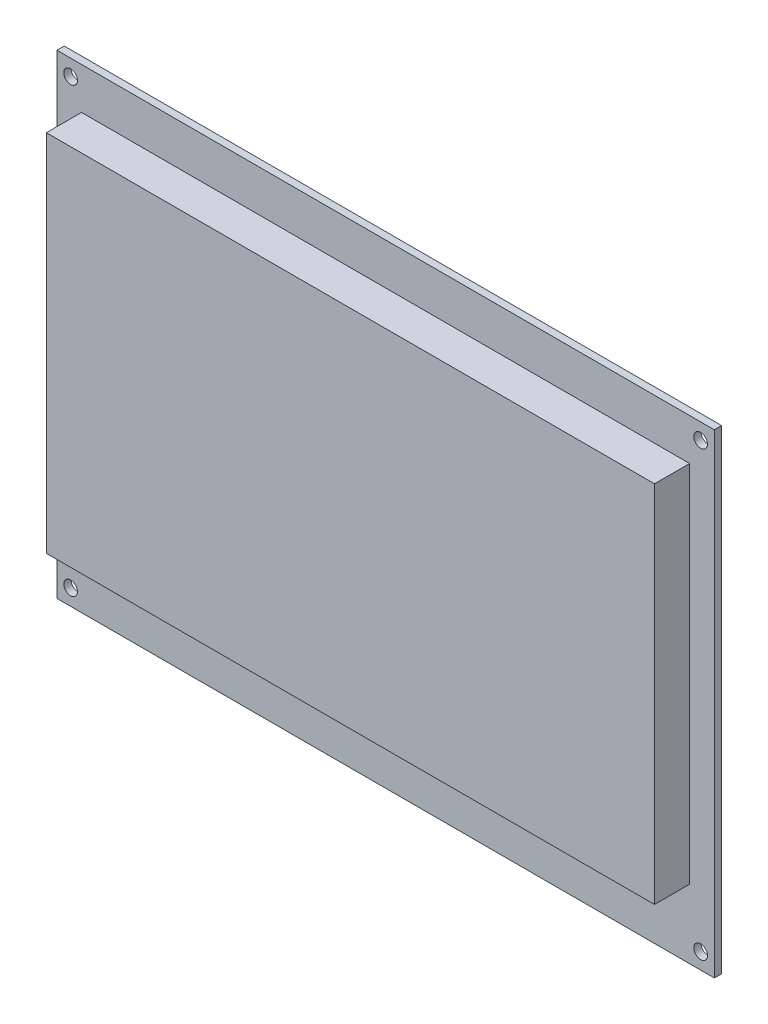
ISO-10303-21;
HEADER;
FILE_DESCRIPTION(('STEP AP214'),'2;1');
FILE_NAME('part.step','',(''),(''),'','','');
FILE_SCHEMA(('AUTOMOTIVE_DESIGN { 1 0 10303 214 1 1 1 1 }'));
ENDSEC;
DATA;
#1=APPLICATION_CONTEXT('core data for automotive mechanical design processes');
#2=APPLICATION_PROTOCOL_DEFINITION('international standard','automotive_design',2000,#1);
#3=PRODUCT_CONTEXT('',#1,'mechanical');
#4=PRODUCT('Part','Part','',(#3));
#5=PRODUCT_RELATED_PRODUCT_CATEGORY('part','',(#4));
#6=PRODUCT_DEFINITION_FORMATION('','',#4);
#7=PRODUCT_DEFINITION_CONTEXT('part definition',#1,'design');
#8=PRODUCT_DEFINITION('design','',#6,#7);
#9=PRODUCT_DEFINITION_SHAPE('','',#8);
#10=(LENGTH_UNIT() NAMED_UNIT(*) SI_UNIT(.MILLI.,.METRE.));
#11=(NAMED_UNIT(*) PLANE_ANGLE_UNIT() SI_UNIT($,.RADIAN.));
#12=(NAMED_UNIT(*) SI_UNIT($,.STERADIAN.) SOLID_ANGLE_UNIT());
#13=UNCERTAINTY_MEASURE_WITH_UNIT(LENGTH_MEASURE(1.E-05),#10,'distance_accuracy_value','');
#14=(GEOMETRIC_REPRESENTATION_CONTEXT(3) GLOBAL_UNCERTAINTY_ASSIGNED_CONTEXT((#13)) GLOBAL_UNIT_ASSIGNED_CONTEXT((#10,
#11,#12)) REPRESENTATION_CONTEXT('',''));
#15=CARTESIAN_POINT('',(0.,0.,0.));
#16=DIRECTION('',(0.,0.,1.));
#17=DIRECTION('',(1.,0.,0.));
#18=AXIS2_PLACEMENT_3D('',#15,#16,#17);
#19=CARTESIAN_POINT('',(0.,52.,1.6));
#20=DIRECTION('',(0.,-1.,0.));
#21=DIRECTION('',(0.,0.,-1.));
#22=AXIS2_PLACEMENT_3D('',#19,#20,#21);
#23=PLANE('',#22);
#24=DIRECTION('',(-1.,0.,0.));
#25=VECTOR('',#24,1.);
#26=CARTESIAN_POINT('',(0.,52.,0.));
#27=LINE('',#26,#25);
#28=CARTESIAN_POINT('',(72.0000000000001,52.,0.));
#29=VERTEX_POINT('',#28);
#30=CARTESIAN_POINT('',(-72.0000000000001,52.,0.));
#31=VERTEX_POINT('',#30);
#32=EDGE_CURVE('E128',#29,#31,#27,.T.);
#33=ORIENTED_EDGE('',*,*,#32,.T.);
#34=DIRECTION('',(0.,0.,-1.));
#35=VECTOR('',#34,1.);
#36=CARTESIAN_POINT('',(-72.0000000000001,52.,1.6));
#37=LINE('',#36,#35);
#38=CARTESIAN_POINT('',(-72.0000000000001,52.,1.6));
#39=VERTEX_POINT('',#38);
#40=EDGE_CURVE('E11',#39,#31,#37,.T.);
#41=ORIENTED_EDGE('',*,*,#40,.F.);
#42=DIRECTION('',(-1.,0.,0.));
#43=VECTOR('',#42,1.);
#44=CARTESIAN_POINT('',(0.,52.,1.6));
#45=LINE('',#44,#43);
#46=CARTESIAN_POINT('',(72.0000000000001,52.,1.6));
#47=VERTEX_POINT('',#46);
#48=EDGE_CURVE('E102',#47,#39,#45,.T.);
#49=ORIENTED_EDGE('',*,*,#48,.F.);
#50=DIRECTION('',(0.,0.,-1.));
#51=VECTOR('',#50,1.);
#52=CARTESIAN_POINT('',(72.0000000000001,52.,1.6));
#53=LINE('',#52,#51);
#54=EDGE_CURVE('E111',#47,#29,#53,.T.);
#55=ORIENTED_EDGE('',*,*,#54,.T.);
#56=EDGE_LOOP('',(#33,#41,#49,#55));
#57=FACE_BOUND('',#56,.T.);
#58=ADVANCED_FACE('F34',(#57),#23,.F.);
#59=CARTESIAN_POINT('',(-72.0000000000001,0.,1.6));
#60=DIRECTION('',(1.,0.,0.));
#61=DIRECTION('',(0.,0.,-1.));
#62=AXIS2_PLACEMENT_3D('',#59,#60,#61);
#63=PLANE('',#62);
#64=DIRECTION('',(0.,-1.,0.));
#65=VECTOR('',#64,1.);
#66=CARTESIAN_POINT('',(-72.0000000000001,0.,0.));
#67=LINE('',#66,#65);
#68=CARTESIAN_POINT('',(-72.0000000000001,-52.,0.));
#69=VERTEX_POINT('',#68);
#70=EDGE_CURVE('E107',#31,#69,#67,.T.);
#71=ORIENTED_EDGE('',*,*,#70,.T.);
#72=DIRECTION('',(0.,0.,-1.));
#73=VECTOR('',#72,1.);
#74=CARTESIAN_POINT('',(-72.0000000000001,-52.,1.6));
#75=LINE('',#74,#73);
#76=CARTESIAN_POINT('',(-72.0000000000001,-52.,1.6));
#77=VERTEX_POINT('',#76);
#78=EDGE_CURVE('E43',#77,#69,#75,.T.);
#79=ORIENTED_EDGE('',*,*,#78,.F.);
#80=DIRECTION('',(0.,-1.,0.));
#81=VECTOR('',#80,1.);
#82=CARTESIAN_POINT('',(-72.0000000000001,0.,1.6));
#83=LINE('',#82,#81);
#84=EDGE_CURVE('E96',#39,#77,#83,.T.);
#85=ORIENTED_EDGE('',*,*,#84,.F.);
#86=ORIENTED_EDGE('',*,*,#40,.T.);
#87=EDGE_LOOP('',(#71,#79,#85,#86));
#88=FACE_BOUND('',#87,.T.);
#89=ADVANCED_FACE('F106',(#88),#63,.F.);
#90=CARTESIAN_POINT('',(0.,-52.,1.6));
#91=DIRECTION('',(0.,1.,0.));
#92=DIRECTION('',(0.,0.,1.));
#93=AXIS2_PLACEMENT_3D('',#90,#91,#92);
#94=PLANE('',#93);
#95=DIRECTION('',(1.,0.,0.));
#96=VECTOR('',#95,1.);
#97=CARTESIAN_POINT('',(0.,-52.,0.));
#98=LINE('',#97,#96);
#99=CARTESIAN_POINT('',(72.0000000000001,-52.,0.));
#100=VERTEX_POINT('',#99);
#101=EDGE_CURVE('E69',#69,#100,#98,.T.);
#102=ORIENTED_EDGE('',*,*,#101,.T.);
#103=DIRECTION('',(0.,0.,-1.));
#104=VECTOR('',#103,1.);
#105=CARTESIAN_POINT('',(72.0000000000001,-52.,1.6));
#106=LINE('',#105,#104);
#107=CARTESIAN_POINT('',(72.0000000000001,-52.,1.6));
#108=VERTEX_POINT('',#107);
#109=EDGE_CURVE('E108',#108,#100,#106,.T.);
#110=ORIENTED_EDGE('',*,*,#109,.F.);
#111=DIRECTION('',(1.,0.,0.));
#112=VECTOR('',#111,1.);
#113=CARTESIAN_POINT('',(0.,-52.,1.6));
#114=LINE('',#113,#112);
#115=EDGE_CURVE('E100',#77,#108,#114,.T.);
#116=ORIENTED_EDGE('',*,*,#115,.F.);
#117=ORIENTED_EDGE('',*,*,#78,.T.);
#118=EDGE_LOOP('',(#102,#110,#116,#117));
#119=FACE_BOUND('',#118,.T.);
#120=ADVANCED_FACE('F109',(#119),#94,.F.);
#121=CARTESIAN_POINT('',(-68.9999999999999,48.5,1.6));
#122=DIRECTION('',(0.,0.,-1.));
#123=DIRECTION('',(-1.,0.,0.));
#124=AXIS2_PLACEMENT_3D('',#121,#122,#123);
#125=CYLINDRICAL_SURFACE('',#124,1.50000000000005);
#126=CARTESIAN_POINT('',(-68.9999999999999,48.5,1.6));
#127=DIRECTION('',(0.,0.,1.));
#128=DIRECTION('',(1.,0.,0.));
#129=AXIS2_PLACEMENT_3D('',#126,#127,#128);
#130=CIRCLE('',#129,1.50000000000005);
#131=CARTESIAN_POINT('',(-67.4999999999999,48.5,1.6));
#132=VERTEX_POINT('',#131);
#133=EDGE_CURVE('E151',#132,#132,#130,.T.);
#134=ORIENTED_EDGE('',*,*,#133,.T.);
#135=EDGE_LOOP('',(#134));
#136=FACE_BOUND('',#135,.T.);
#137=CARTESIAN_POINT('',(-68.9999999999999,48.5,0.));
#138=DIRECTION('',(0.,0.,1.));
#139=DIRECTION('',(1.,0.,0.));
#140=AXIS2_PLACEMENT_3D('',#137,#138,#139);
#141=CIRCLE('',#140,1.50000000000005);
#142=CARTESIAN_POINT('',(-67.4999999999999,48.5,0.));
#143=VERTEX_POINT('',#142);
#144=EDGE_CURVE('E125',#143,#143,#141,.T.);
#145=ORIENTED_EDGE('',*,*,#144,.F.);
#146=EDGE_LOOP('',(#145));
#147=FACE_BOUND('',#146,.T.);
#148=ADVANCED_FACE('F230',(#136,#147),#125,.F.);
#149=CARTESIAN_POINT('',(68.9999999999999,48.5,1.6));
#150=DIRECTION('',(0.,0.,-1.));
#151=DIRECTION('',(-1.,0.,0.));
#152=AXIS2_PLACEMENT_3D('',#149,#150,#151);
#153=CYLINDRICAL_SURFACE('',#152,1.50000000000005);
#154=CARTESIAN_POINT('',(68.9999999999999,48.5,1.6));
#155=DIRECTION('',(0.,0.,1.));
#156=DIRECTION('',(1.,0.,0.));
#157=AXIS2_PLACEMENT_3D('',#154,#155,#156);
#158=CIRCLE('',#157,1.50000000000005);
#159=CARTESIAN_POINT('',(70.5,48.5,1.6));
#160=VERTEX_POINT('',#159);
#161=EDGE_CURVE('E154',#160,#160,#158,.T.);
#162=ORIENTED_EDGE('',*,*,#161,.T.);
#163=EDGE_LOOP('',(#162));
#164=FACE_BOUND('',#163,.T.);
#165=CARTESIAN_POINT('',(68.9999999999999,48.5,0.));
#166=DIRECTION('',(0.,0.,1.));
#167=DIRECTION('',(1.,0.,0.));
#168=AXIS2_PLACEMENT_3D('',#165,#166,#167);
#169=CIRCLE('',#168,1.50000000000005);
#170=CARTESIAN_POINT('',(70.5,48.5,0.));
#171=VERTEX_POINT('',#170);
#172=EDGE_CURVE('E122',#171,#171,#169,.T.);
#173=ORIENTED_EDGE('',*,*,#172,.F.);
#174=EDGE_LOOP('',(#173));
#175=FACE_BOUND('',#174,.T.);
#176=ADVANCED_FACE('F233',(#164,#175),#153,.F.);
#177=CARTESIAN_POINT('',(-68.9999999999999,-48.5,1.6));
#178=DIRECTION('',(0.,0.,-1.));
#179=DIRECTION('',(-1.,0.,0.));
#180=AXIS2_PLACEMENT_3D('',#177,#178,#179);
#181=CYLINDRICAL_SURFACE('',#180,1.50000000000005);
#182=CARTESIAN_POINT('',(-68.9999999999999,-48.5,1.6));
#183=DIRECTION('',(0.,0.,1.));
#184=DIRECTION('',(1.,0.,0.));
#185=AXIS2_PLACEMENT_3D('',#182,#183,#184);
#186=CIRCLE('',#185,1.50000000000005);
#187=CARTESIAN_POINT('',(-67.4999999999999,-48.5,1.6));
#188=VERTEX_POINT('',#187);
#189=EDGE_CURVE('E157',#188,#188,#186,.T.);
#190=ORIENTED_EDGE('',*,*,#189,.T.);
#191=EDGE_LOOP('',(#190));
#192=FACE_BOUND('',#191,.T.);
#193=CARTESIAN_POINT('',(-68.9999999999999,-48.5,0.));
#194=DIRECTION('',(0.,0.,1.));
#195=DIRECTION('',(1.,0.,0.));
#196=AXIS2_PLACEMENT_3D('',#193,#194,#195);
#197=CIRCLE('',#196,1.50000000000005);
#198=CARTESIAN_POINT('',(-67.4999999999999,-48.5,0.));
#199=VERTEX_POINT('',#198);
#200=EDGE_CURVE('E118',#199,#199,#197,.T.);
#201=ORIENTED_EDGE('',*,*,#200,.F.);
#202=EDGE_LOOP('',(#201));
#203=FACE_BOUND('',#202,.T.);
#204=ADVANCED_FACE('F236',(#192,#203),#181,.F.);
#205=CARTESIAN_POINT('',(68.9999999999999,-48.5,1.6));
#206=DIRECTION('',(0.,0.,-1.));
#207=DIRECTION('',(-1.,0.,0.));
#208=AXIS2_PLACEMENT_3D('',#205,#206,#207);
#209=CYLINDRICAL_SURFACE('',#208,1.50000000000005);
#210=CARTESIAN_POINT('',(68.9999999999999,-48.5,1.6));
#211=DIRECTION('',(0.,0.,1.));
#212=DIRECTION('',(1.,0.,0.));
#213=AXIS2_PLACEMENT_3D('',#210,#211,#212);
#214=CIRCLE('',#213,1.50000000000005);
#215=CARTESIAN_POINT('',(70.5,-48.5,1.6));
#216=VERTEX_POINT('',#215);
#217=EDGE_CURVE('E134',#216,#216,#214,.T.);
#218=ORIENTED_EDGE('',*,*,#217,.T.);
#219=EDGE_LOOP('',(#218));
#220=FACE_BOUND('',#219,.T.);
#221=CARTESIAN_POINT('',(68.9999999999999,-48.5,0.));
#222=DIRECTION('',(0.,0.,1.));
#223=DIRECTION('',(1.,0.,0.));
#224=AXIS2_PLACEMENT_3D('',#221,#222,#223);
#225=CIRCLE('',#224,1.50000000000005);
#226=CARTESIAN_POINT('',(70.5,-48.5,0.));
#227=VERTEX_POINT('',#226);
#228=EDGE_CURVE('E115',#227,#227,#225,.T.);
#229=ORIENTED_EDGE('',*,*,#228,.F.);
#230=EDGE_LOOP('',(#229));
#231=FACE_BOUND('',#230,.T.);
#232=ADVANCED_FACE('F36',(#220,#231),#209,.F.);
#233=CARTESIAN_POINT('',(72.0000000000001,0.,1.6));
#234=DIRECTION('',(-1.,0.,0.));
#235=DIRECTION('',(0.,-1.,0.));
#236=AXIS2_PLACEMENT_3D('',#233,#234,#235);
#237=PLANE('',#236);
#238=DIRECTION('',(0.,1.,0.));
#239=VECTOR('',#238,1.);
#240=CARTESIAN_POINT('',(72.0000000000001,0.,0.));
#241=LINE('',#240,#239);
#242=EDGE_CURVE('E75',#100,#29,#241,.T.);
#243=ORIENTED_EDGE('',*,*,#242,.T.);
#244=ORIENTED_EDGE('',*,*,#54,.F.);
#245=DIRECTION('',(0.,1.,0.));
#246=VECTOR('',#245,1.);
#247=CARTESIAN_POINT('',(72.0000000000001,0.,1.6));
#248=LINE('',#247,#246);
#249=EDGE_CURVE('E51',#108,#47,#248,.T.);
#250=ORIENTED_EDGE('',*,*,#249,.F.);
#251=ORIENTED_EDGE('',*,*,#109,.T.);
#252=EDGE_LOOP('',(#243,#244,#250,#251));
#253=FACE_BOUND('',#252,.T.);
#254=ADVANCED_FACE('F136',(#253),#237,.F.);
#255=CARTESIAN_POINT('',(0.,0.,1.6));
#256=DIRECTION('',(0.,0.,1.));
#257=DIRECTION('',(1.,0.,0.));
#258=AXIS2_PLACEMENT_3D('',#255,#256,#257);
#259=PLANE('',#258);
#260=ORIENTED_EDGE('',*,*,#217,.F.);
#261=EDGE_LOOP('',(#260));
#262=FACE_BOUND('',#261,.T.);
#263=ORIENTED_EDGE('',*,*,#189,.F.);
#264=EDGE_LOOP('',(#263));
#265=FACE_BOUND('',#264,.T.);
#266=ORIENTED_EDGE('',*,*,#161,.F.);
#267=EDGE_LOOP('',(#266));
#268=FACE_BOUND('',#267,.T.);
#269=ORIENTED_EDGE('',*,*,#133,.F.);
#270=EDGE_LOOP('',(#269));
#271=FACE_BOUND('',#270,.T.);
#272=DIRECTION('',(0.,-1.,0.));
#273=VECTOR('',#272,1.);
#274=CARTESIAN_POINT('',(-66.6,0.,1.6));
#275=LINE('',#274,#273);
#276=CARTESIAN_POINT('',(-66.6,42.9,1.6));
#277=VERTEX_POINT('',#276);
#278=CARTESIAN_POINT('',(-66.6,-36.8999999999999,1.6));
#279=VERTEX_POINT('',#278);
#280=EDGE_CURVE('E84',#277,#279,#275,.T.);
#281=ORIENTED_EDGE('',*,*,#280,.F.);
#282=DIRECTION('',(-1.,0.,0.));
#283=VECTOR('',#282,1.);
#284=CARTESIAN_POINT('',(0.,42.9,1.6));
#285=LINE('',#284,#283);
#286=CARTESIAN_POINT('',(66.6,42.9,1.6));
#287=VERTEX_POINT('',#286);
#288=EDGE_CURVE('E148',#287,#277,#285,.T.);
#289=ORIENTED_EDGE('',*,*,#288,.F.);
#290=DIRECTION('',(0.,1.,0.));
#291=VECTOR('',#290,1.);
#292=CARTESIAN_POINT('',(66.6,0.,1.6));
#293=LINE('',#292,#291);
#294=CARTESIAN_POINT('',(66.6,-36.8999999999999,1.6));
#295=VERTEX_POINT('',#294);
#296=EDGE_CURVE('E143',#295,#287,#293,.T.);
#297=ORIENTED_EDGE('',*,*,#296,.F.);
#298=DIRECTION('',(1.,0.,0.));
#299=VECTOR('',#298,1.);
#300=CARTESIAN_POINT('',(0.,-36.8999999999999,1.6));
#301=LINE('',#300,#299);
#302=EDGE_CURVE('E141',#279,#295,#301,.T.);
#303=ORIENTED_EDGE('',*,*,#302,.F.);
#304=EDGE_LOOP('',(#281,#289,#297,#303));
#305=FACE_BOUND('',#304,.T.);
#306=ORIENTED_EDGE('',*,*,#48,.T.);
#307=ORIENTED_EDGE('',*,*,#84,.T.);
#308=ORIENTED_EDGE('',*,*,#115,.T.);
#309=ORIENTED_EDGE('',*,*,#249,.T.);
#310=EDGE_LOOP('',(#306,#307,#308,#309));
#311=FACE_BOUND('',#310,.T.);
#312=ADVANCED_FACE('F98',(#262,#265,#268,#271,#305,#311),#259,.T.);
#313=CARTESIAN_POINT('',(0.,0.,0.));
#314=DIRECTION('',(0.,0.,1.));
#315=DIRECTION('',(1.,0.,0.));
#316=AXIS2_PLACEMENT_3D('',#313,#314,#315);
#317=PLANE('',#316);
#318=ORIENTED_EDGE('',*,*,#228,.T.);
#319=EDGE_LOOP('',(#318));
#320=FACE_BOUND('',#319,.T.);
#321=ORIENTED_EDGE('',*,*,#200,.T.);
#322=EDGE_LOOP('',(#321));
#323=FACE_BOUND('',#322,.T.);
#324=ORIENTED_EDGE('',*,*,#172,.T.);
#325=EDGE_LOOP('',(#324));
#326=FACE_BOUND('',#325,.T.);
#327=ORIENTED_EDGE('',*,*,#144,.T.);
#328=EDGE_LOOP('',(#327));
#329=FACE_BOUND('',#328,.T.);
#330=ORIENTED_EDGE('',*,*,#32,.F.);
#331=ORIENTED_EDGE('',*,*,#242,.F.);
#332=ORIENTED_EDGE('',*,*,#101,.F.);
#333=ORIENTED_EDGE('',*,*,#70,.F.);
#334=EDGE_LOOP('',(#330,#331,#332,#333));
#335=FACE_BOUND('',#334,.T.);
#336=ADVANCED_FACE('F139',(#320,#323,#326,#329,#335),#317,.F.);
#337=CARTESIAN_POINT('',(66.6,-36.8999999999999,9.3));
#338=DIRECTION('',(0.,-1.,0.));
#339=DIRECTION('',(0.,0.,-1.));
#340=AXIS2_PLACEMENT_3D('',#337,#338,#339);
#341=PLANE('',#340);
#342=DIRECTION('',(0.,0.,-1.));
#343=VECTOR('',#342,1.);
#344=CARTESIAN_POINT('',(-66.6,-36.8999999999999,9.3));
#345=LINE('',#344,#343);
#346=CARTESIAN_POINT('',(-66.6,-36.8999999999999,9.3));
#347=VERTEX_POINT('',#346);
#348=EDGE_CURVE('E162',#347,#279,#345,.T.);
#349=ORIENTED_EDGE('',*,*,#348,.T.);
#350=ORIENTED_EDGE('',*,*,#302,.T.);
#351=DIRECTION('',(0.,0.,-1.));
#352=VECTOR('',#351,1.);
#353=CARTESIAN_POINT('',(66.6,-36.8999999999999,9.3));
#354=LINE('',#353,#352);
#355=CARTESIAN_POINT('',(66.6,-36.8999999999999,9.3));
#356=VERTEX_POINT('',#355);
#357=EDGE_CURVE('E119',#356,#295,#354,.T.);
#358=ORIENTED_EDGE('',*,*,#357,.F.);
#359=DIRECTION('',(-1.,0.,0.));
#360=VECTOR('',#359,1.);
#361=CARTESIAN_POINT('',(66.6,-36.8999999999999,9.3));
#362=LINE('',#361,#360);
#363=EDGE_CURVE('E182',#356,#347,#362,.T.);
#364=ORIENTED_EDGE('',*,*,#363,.T.);
#365=EDGE_LOOP('',(#349,#350,#358,#364));
#366=FACE_BOUND('',#365,.T.);
#367=ADVANCED_FACE('F188',(#366),#341,.T.);
#368=CARTESIAN_POINT('',(66.6,42.9,9.3));
#369=DIRECTION('',(1.,0.,0.));
#370=DIRECTION('',(0.,0.,-1.));
#371=AXIS2_PLACEMENT_3D('',#368,#369,#370);
#372=PLANE('',#371);
#373=ORIENTED_EDGE('',*,*,#357,.T.);
#374=ORIENTED_EDGE('',*,*,#296,.T.);
#375=DIRECTION('',(0.,0.,-1.));
#376=VECTOR('',#375,1.);
#377=CARTESIAN_POINT('',(66.6,42.9,9.3));
#378=LINE('',#377,#376);
#379=CARTESIAN_POINT('',(66.6,42.9,9.3));
#380=VERTEX_POINT('',#379);
#381=EDGE_CURVE('E169',#380,#287,#378,.T.);
#382=ORIENTED_EDGE('',*,*,#381,.F.);
#383=DIRECTION('',(0.,-1.,0.));
#384=VECTOR('',#383,1.);
#385=CARTESIAN_POINT('',(66.6,42.9,9.3));
#386=LINE('',#385,#384);
#387=EDGE_CURVE('E166',#380,#356,#386,.T.);
#388=ORIENTED_EDGE('',*,*,#387,.T.);
#389=EDGE_LOOP('',(#373,#374,#382,#388));
#390=FACE_BOUND('',#389,.T.);
#391=ADVANCED_FACE('F201',(#390),#372,.T.);
#392=CARTESIAN_POINT('',(-66.6,42.9,9.3));
#393=DIRECTION('',(0.,1.,0.));
#394=DIRECTION('',(-1.,0.,0.));
#395=AXIS2_PLACEMENT_3D('',#392,#393,#394);
#396=PLANE('',#395);
#397=ORIENTED_EDGE('',*,*,#381,.T.);
#398=ORIENTED_EDGE('',*,*,#288,.T.);
#399=DIRECTION('',(0.,0.,-1.));
#400=VECTOR('',#399,1.);
#401=CARTESIAN_POINT('',(-66.6,42.9,9.3));
#402=LINE('',#401,#400);
#403=CARTESIAN_POINT('',(-66.6,42.9,9.3));
#404=VERTEX_POINT('',#403);
#405=EDGE_CURVE('E165',#404,#277,#402,.T.);
#406=ORIENTED_EDGE('',*,*,#405,.F.);
#407=DIRECTION('',(1.,0.,0.));
#408=VECTOR('',#407,1.);
#409=CARTESIAN_POINT('',(-66.6,42.9,9.3));
#410=LINE('',#409,#408);
#411=EDGE_CURVE('E176',#404,#380,#410,.T.);
#412=ORIENTED_EDGE('',*,*,#411,.T.);
#413=EDGE_LOOP('',(#397,#398,#406,#412));
#414=FACE_BOUND('',#413,.T.);
#415=ADVANCED_FACE('F205',(#414),#396,.T.);
#416=CARTESIAN_POINT('',(-66.6,-36.8999999999999,9.3));
#417=DIRECTION('',(-1.,0.,0.));
#418=DIRECTION('',(0.,-1.,0.));
#419=AXIS2_PLACEMENT_3D('',#416,#417,#418);
#420=PLANE('',#419);
#421=ORIENTED_EDGE('',*,*,#405,.T.);
#422=ORIENTED_EDGE('',*,*,#280,.T.);
#423=ORIENTED_EDGE('',*,*,#348,.F.);
#424=DIRECTION('',(0.,1.,0.));
#425=VECTOR('',#424,1.);
#426=CARTESIAN_POINT('',(-66.6,-36.8999999999999,9.3));
#427=LINE('',#426,#425);
#428=EDGE_CURVE('E179',#347,#404,#427,.T.);
#429=ORIENTED_EDGE('',*,*,#428,.T.);
#430=EDGE_LOOP('',(#421,#422,#423,#429));
#431=FACE_BOUND('',#430,.T.);
#432=ADVANCED_FACE('F208',(#431),#420,.T.);
#433=CARTESIAN_POINT('',(66.6,-36.8999999999999,9.3));
#434=DIRECTION('',(0.,0.,1.));
#435=DIRECTION('',(1.,0.,0.));
#436=AXIS2_PLACEMENT_3D('',#433,#434,#435);
#437=PLANE('',#436);
#438=ORIENTED_EDGE('',*,*,#363,.F.);
#439=ORIENTED_EDGE('',*,*,#387,.F.);
#440=ORIENTED_EDGE('',*,*,#411,.F.);
#441=ORIENTED_EDGE('',*,*,#428,.F.);
#442=EDGE_LOOP('',(#438,#439,#440,#441));
#443=FACE_BOUND('',#442,.T.);
#444=ADVANCED_FACE('F196',(#443),#437,.T.);
#445=CLOSED_SHELL('',(#58,#89,#120,#148,#176,#204,#232,#254,#312,#336,#367,#391,#415,#432,#444));
#446=MANIFOLD_SOLID_BREP('B2',#445);
#447=ADVANCED_BREP_SHAPE_REPRESENTATION('',(#18,#446),#14);
#448=SHAPE_DEFINITION_REPRESENTATION(#9,#447);
ENDSEC;
END-ISO-10303-21;
